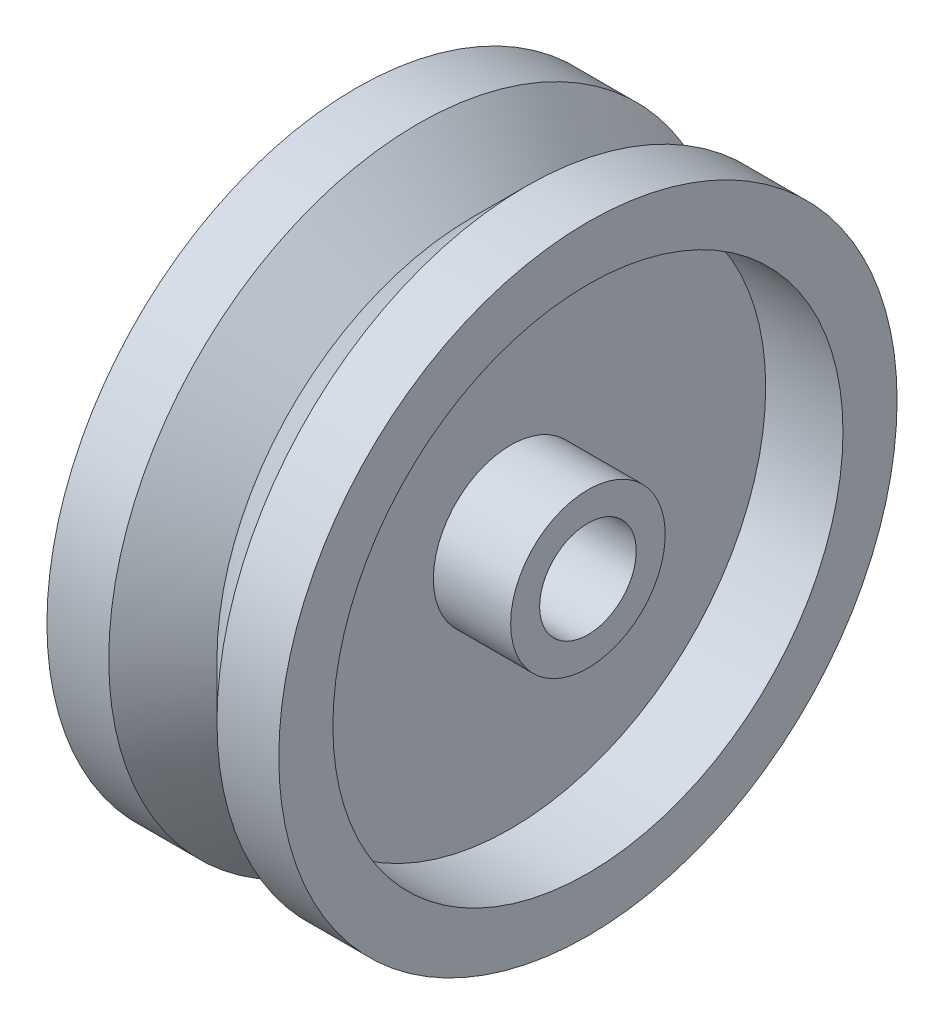
ISO-10303-21;
HEADER;
FILE_DESCRIPTION(('STEP AP214'),'2;1');
FILE_NAME('part.step','',(''),(''),'','','');
FILE_SCHEMA(('AUTOMOTIVE_DESIGN { 1 0 10303 214 1 1 1 1 }'));
ENDSEC;
DATA;
#1=APPLICATION_CONTEXT('core data for automotive mechanical design processes');
#2=APPLICATION_PROTOCOL_DEFINITION('international standard','automotive_design',2000,#1);
#3=PRODUCT_CONTEXT('',#1,'mechanical');
#4=PRODUCT('Part','Part','',(#3));
#5=PRODUCT_RELATED_PRODUCT_CATEGORY('part','',(#4));
#6=PRODUCT_DEFINITION_FORMATION('','',#4);
#7=PRODUCT_DEFINITION_CONTEXT('part definition',#1,'design');
#8=PRODUCT_DEFINITION('design','',#6,#7);
#9=PRODUCT_DEFINITION_SHAPE('','',#8);
#10=(LENGTH_UNIT() NAMED_UNIT(*) SI_UNIT(.MILLI.,.METRE.));
#11=(NAMED_UNIT(*) PLANE_ANGLE_UNIT() SI_UNIT($,.RADIAN.));
#12=(NAMED_UNIT(*) SI_UNIT($,.STERADIAN.) SOLID_ANGLE_UNIT());
#13=UNCERTAINTY_MEASURE_WITH_UNIT(LENGTH_MEASURE(1.E-05),#10,'distance_accuracy_value','');
#14=(GEOMETRIC_REPRESENTATION_CONTEXT(3) GLOBAL_UNCERTAINTY_ASSIGNED_CONTEXT((#13)) GLOBAL_UNIT_ASSIGNED_CONTEXT((#10,
#11,#12)) REPRESENTATION_CONTEXT('',''));
#15=CARTESIAN_POINT('',(0.,0.,0.));
#16=DIRECTION('',(0.,0.,1.));
#17=DIRECTION('',(1.,0.,0.));
#18=AXIS2_PLACEMENT_3D('',#15,#16,#17);
#19=CARTESIAN_POINT('',(-7.5,0.,-3.125));
#20=DIRECTION('',(1.,0.,0.));
#21=DIRECTION('',(0.,0.,-1.));
#22=AXIS2_PLACEMENT_3D('',#19,#20,#21);
#23=PLANE('',#22);
#24=CARTESIAN_POINT('',(-7.49999999999999,0.,0.));
#25=DIRECTION('',(-1.,0.,0.));
#26=DIRECTION('',(0.,0.,1.));
#27=AXIS2_PLACEMENT_3D('',#24,#25,#26);
#28=CIRCLE('',#27,3.125);
#29=CARTESIAN_POINT('',(-7.49999999999999,0.,3.125));
#30=VERTEX_POINT('',#29);
#31=EDGE_CURVE('E88',#30,#30,#28,.T.);
#32=ORIENTED_EDGE('',*,*,#31,.F.);
#33=EDGE_LOOP('',(#32));
#34=FACE_BOUND('',#33,.T.);
#35=CARTESIAN_POINT('',(-7.49999999999999,0.,0.));
#36=DIRECTION('',(-1.,0.,0.));
#37=DIRECTION('',(0.,0.,1.));
#38=AXIS2_PLACEMENT_3D('',#35,#36,#37);
#39=CIRCLE('',#38,5.);
#40=CARTESIAN_POINT('',(-7.49999999999999,0.,5.));
#41=VERTEX_POINT('',#40);
#42=EDGE_CURVE('E10',#41,#41,#39,.T.);
#43=ORIENTED_EDGE('',*,*,#42,.T.);
#44=EDGE_LOOP('',(#43));
#45=FACE_BOUND('',#44,.T.);
#46=ADVANCED_FACE('F39',(#34,#45),#23,.F.);
#47=CARTESIAN_POINT('',(-45.0431034482759,0.,0.));
#48=DIRECTION('',(-1.,0.,0.));
#49=DIRECTION('',(0.,0.,1.));
#50=AXIS2_PLACEMENT_3D('',#47,#48,#49);
#51=CYLINDRICAL_SURFACE('',#50,5.);
#52=ORIENTED_EDGE('',*,*,#42,.F.);
#53=EDGE_LOOP('',(#52));
#54=FACE_BOUND('',#53,.T.);
#55=CARTESIAN_POINT('',(-2.5,0.,0.));
#56=DIRECTION('',(-1.,0.,0.));
#57=DIRECTION('',(0.,0.,1.));
#58=AXIS2_PLACEMENT_3D('',#55,#56,#57);
#59=CIRCLE('',#58,5.);
#60=CARTESIAN_POINT('',(-2.5,0.,5.));
#61=VERTEX_POINT('',#60);
#62=EDGE_CURVE('E45',#61,#61,#59,.T.);
#63=ORIENTED_EDGE('',*,*,#62,.T.);
#64=EDGE_LOOP('',(#63));
#65=FACE_BOUND('',#64,.T.);
#66=ADVANCED_FACE('F95',(#54,#65),#51,.T.);
#67=CARTESIAN_POINT('',(-2.5,0.,-16.5));
#68=DIRECTION('',(1.,0.,0.));
#69=DIRECTION('',(0.,0.,-1.));
#70=AXIS2_PLACEMENT_3D('',#67,#68,#69);
#71=PLANE('',#70);
#72=ORIENTED_EDGE('',*,*,#62,.F.);
#73=EDGE_LOOP('',(#72));
#74=FACE_BOUND('',#73,.T.);
#75=CARTESIAN_POINT('',(-2.5,0.,0.));
#76=DIRECTION('',(-1.,0.,0.));
#77=DIRECTION('',(0.,0.,1.));
#78=AXIS2_PLACEMENT_3D('',#75,#76,#77);
#79=CIRCLE('',#78,16.5);
#80=CARTESIAN_POINT('',(-2.5,0.,16.5));
#81=VERTEX_POINT('',#80);
#82=EDGE_CURVE('E49',#81,#81,#79,.T.);
#83=ORIENTED_EDGE('',*,*,#82,.T.);
#84=EDGE_LOOP('',(#83));
#85=FACE_BOUND('',#84,.T.);
#86=ADVANCED_FACE('F99',(#74,#85),#71,.F.);
#87=CARTESIAN_POINT('',(-45.0431034482759,0.,0.));
#88=DIRECTION('',(-1.,0.,0.));
#89=DIRECTION('',(0.,0.,1.));
#90=AXIS2_PLACEMENT_3D('',#87,#88,#89);
#91=CYLINDRICAL_SURFACE('',#90,16.5);
#92=ORIENTED_EDGE('',*,*,#82,.F.);
#93=EDGE_LOOP('',(#92));
#94=FACE_BOUND('',#93,.T.);
#95=CARTESIAN_POINT('',(-7.5,0.,0.));
#96=DIRECTION('',(-1.,0.,0.));
#97=DIRECTION('',(0.,0.,1.));
#98=AXIS2_PLACEMENT_3D('',#95,#96,#97);
#99=CIRCLE('',#98,16.5);
#100=CARTESIAN_POINT('',(-7.5,0.,16.5));
#101=VERTEX_POINT('',#100);
#102=EDGE_CURVE('E53',#101,#101,#99,.T.);
#103=ORIENTED_EDGE('',*,*,#102,.T.);
#104=EDGE_LOOP('',(#103));
#105=FACE_BOUND('',#104,.T.);
#106=ADVANCED_FACE('F104',(#94,#105),#91,.F.);
#107=CARTESIAN_POINT('',(-7.5,0.,-16.5));
#108=DIRECTION('',(1.,0.,0.));
#109=DIRECTION('',(0.,0.,-1.));
#110=AXIS2_PLACEMENT_3D('',#107,#108,#109);
#111=PLANE('',#110);
#112=ORIENTED_EDGE('',*,*,#102,.F.);
#113=EDGE_LOOP('',(#112));
#114=FACE_BOUND('',#113,.T.);
#115=CARTESIAN_POINT('',(-7.50000000000001,0.,0.));
#116=DIRECTION('',(-1.,0.,0.));
#117=DIRECTION('',(0.,0.,1.));
#118=AXIS2_PLACEMENT_3D('',#115,#116,#117);
#119=CIRCLE('',#118,20.);
#120=CARTESIAN_POINT('',(-7.50000000000001,0.,20.));
#121=VERTEX_POINT('',#120);
#122=EDGE_CURVE('E58',#121,#121,#119,.T.);
#123=ORIENTED_EDGE('',*,*,#122,.T.);
#124=EDGE_LOOP('',(#123));
#125=FACE_BOUND('',#124,.T.);
#126=ADVANCED_FACE('F110',(#114,#125),#111,.F.);
#127=CARTESIAN_POINT('',(-45.0431034482759,0.,0.));
#128=DIRECTION('',(-1.,0.,0.));
#129=DIRECTION('',(0.,0.,1.));
#130=AXIS2_PLACEMENT_3D('',#127,#128,#129);
#131=CYLINDRICAL_SURFACE('',#130,20.);
#132=ORIENTED_EDGE('',*,*,#122,.F.);
#133=EDGE_LOOP('',(#132));
#134=FACE_BOUND('',#133,.T.);
#135=CARTESIAN_POINT('',(-3.50000000000003,0.,0.));
#136=DIRECTION('',(-1.,0.,0.));
#137=DIRECTION('',(0.,0.,1.));
#138=AXIS2_PLACEMENT_3D('',#135,#136,#137);
#139=CIRCLE('',#138,20.);
#140=CARTESIAN_POINT('',(-3.50000000000003,0.,20.));
#141=VERTEX_POINT('',#140);
#142=EDGE_CURVE('E61',#141,#141,#139,.T.);
#143=ORIENTED_EDGE('',*,*,#142,.T.);
#144=EDGE_LOOP('',(#143));
#145=FACE_BOUND('',#144,.T.);
#146=ADVANCED_FACE('F114',(#134,#145),#131,.T.);
#147=CARTESIAN_POINT('',(0.,0.,0.));
#148=DIRECTION('',(-1.,0.,0.));
#149=DIRECTION('',(0.,0.,1.));
#150=AXIS2_PLACEMENT_3D('',#147,#148,#149);
#151=CONICAL_SURFACE('',#150,16.5,0.785398163397444);
#152=ORIENTED_EDGE('',*,*,#142,.F.);
#153=EDGE_LOOP('',(#152));
#154=FACE_BOUND('',#153,.T.);
#155=CARTESIAN_POINT('',(0.,0.,0.));
#156=DIRECTION('',(-1.,0.,0.));
#157=DIRECTION('',(0.,0.,1.));
#158=AXIS2_PLACEMENT_3D('',#155,#156,#157);
#159=CIRCLE('',#158,16.5);
#160=CARTESIAN_POINT('',(0.,0.,16.5));
#161=VERTEX_POINT('',#160);
#162=EDGE_CURVE('E64',#161,#161,#159,.T.);
#163=ORIENTED_EDGE('',*,*,#162,.T.);
#164=EDGE_LOOP('',(#163));
#165=FACE_BOUND('',#164,.T.);
#166=ADVANCED_FACE('F118',(#154,#165),#151,.T.);
#167=CARTESIAN_POINT('',(3.49999999999996,0.,0.));
#168=DIRECTION('',(1.,0.,0.));
#169=DIRECTION('',(0.,0.,-1.));
#170=AXIS2_PLACEMENT_3D('',#167,#168,#169);
#171=CONICAL_SURFACE('',#170,20.,0.785398163397453);
#172=ORIENTED_EDGE('',*,*,#162,.F.);
#173=EDGE_LOOP('',(#172));
#174=FACE_BOUND('',#173,.T.);
#175=CARTESIAN_POINT('',(3.49999999999996,0.,0.));
#176=DIRECTION('',(-1.,0.,0.));
#177=DIRECTION('',(0.,0.,1.));
#178=AXIS2_PLACEMENT_3D('',#175,#176,#177);
#179=CIRCLE('',#178,20.);
#180=CARTESIAN_POINT('',(3.49999999999996,0.,20.));
#181=VERTEX_POINT('',#180);
#182=EDGE_CURVE('E67',#181,#181,#179,.T.);
#183=ORIENTED_EDGE('',*,*,#182,.T.);
#184=EDGE_LOOP('',(#183));
#185=FACE_BOUND('',#184,.T.);
#186=ADVANCED_FACE('F122',(#174,#185),#171,.T.);
#187=CARTESIAN_POINT('',(-45.0431034482759,0.,0.));
#188=DIRECTION('',(-1.,0.,0.));
#189=DIRECTION('',(0.,0.,1.));
#190=AXIS2_PLACEMENT_3D('',#187,#188,#189);
#191=CYLINDRICAL_SURFACE('',#190,20.);
#192=ORIENTED_EDGE('',*,*,#182,.F.);
#193=EDGE_LOOP('',(#192));
#194=FACE_BOUND('',#193,.T.);
#195=CARTESIAN_POINT('',(7.50000000000001,0.,0.));
#196=DIRECTION('',(-1.,0.,0.));
#197=DIRECTION('',(0.,0.,1.));
#198=AXIS2_PLACEMENT_3D('',#195,#196,#197);
#199=CIRCLE('',#198,20.);
#200=CARTESIAN_POINT('',(7.50000000000001,0.,20.));
#201=VERTEX_POINT('',#200);
#202=EDGE_CURVE('E70',#201,#201,#199,.T.);
#203=ORIENTED_EDGE('',*,*,#202,.T.);
#204=EDGE_LOOP('',(#203));
#205=FACE_BOUND('',#204,.T.);
#206=ADVANCED_FACE('F126',(#194,#205),#191,.T.);
#207=CARTESIAN_POINT('',(7.50000000000001,0.,-16.5));
#208=DIRECTION('',(-1.,0.,0.));
#209=DIRECTION('',(0.,0.,1.));
#210=AXIS2_PLACEMENT_3D('',#207,#208,#209);
#211=PLANE('',#210);
#212=ORIENTED_EDGE('',*,*,#202,.F.);
#213=EDGE_LOOP('',(#212));
#214=FACE_BOUND('',#213,.T.);
#215=CARTESIAN_POINT('',(7.50000000000001,0.,0.));
#216=DIRECTION('',(-1.,0.,0.));
#217=DIRECTION('',(0.,0.,1.));
#218=AXIS2_PLACEMENT_3D('',#215,#216,#217);
#219=CIRCLE('',#218,16.5);
#220=CARTESIAN_POINT('',(7.50000000000001,0.,16.5));
#221=VERTEX_POINT('',#220);
#222=EDGE_CURVE('E73',#221,#221,#219,.T.);
#223=ORIENTED_EDGE('',*,*,#222,.T.);
#224=EDGE_LOOP('',(#223));
#225=FACE_BOUND('',#224,.T.);
#226=ADVANCED_FACE('F130',(#214,#225),#211,.F.);
#227=CARTESIAN_POINT('',(-45.0431034482759,0.,0.));
#228=DIRECTION('',(-1.,0.,0.));
#229=DIRECTION('',(0.,0.,1.));
#230=AXIS2_PLACEMENT_3D('',#227,#228,#229);
#231=CYLINDRICAL_SURFACE('',#230,16.5);
#232=ORIENTED_EDGE('',*,*,#222,.F.);
#233=EDGE_LOOP('',(#232));
#234=FACE_BOUND('',#233,.T.);
#235=CARTESIAN_POINT('',(2.5,0.,0.));
#236=DIRECTION('',(-1.,0.,0.));
#237=DIRECTION('',(0.,0.,1.));
#238=AXIS2_PLACEMENT_3D('',#235,#236,#237);
#239=CIRCLE('',#238,16.5);
#240=CARTESIAN_POINT('',(2.5,0.,16.5));
#241=VERTEX_POINT('',#240);
#242=EDGE_CURVE('E76',#241,#241,#239,.T.);
#243=ORIENTED_EDGE('',*,*,#242,.T.);
#244=EDGE_LOOP('',(#243));
#245=FACE_BOUND('',#244,.T.);
#246=ADVANCED_FACE('F134',(#234,#245),#231,.F.);
#247=CARTESIAN_POINT('',(2.5,0.,-16.5));
#248=DIRECTION('',(-1.,0.,0.));
#249=DIRECTION('',(0.,0.,1.));
#250=AXIS2_PLACEMENT_3D('',#247,#248,#249);
#251=PLANE('',#250);
#252=ORIENTED_EDGE('',*,*,#242,.F.);
#253=EDGE_LOOP('',(#252));
#254=FACE_BOUND('',#253,.T.);
#255=CARTESIAN_POINT('',(2.5,0.,0.));
#256=DIRECTION('',(-1.,0.,0.));
#257=DIRECTION('',(0.,0.,1.));
#258=AXIS2_PLACEMENT_3D('',#255,#256,#257);
#259=CIRCLE('',#258,5.);
#260=CARTESIAN_POINT('',(2.5,0.,5.));
#261=VERTEX_POINT('',#260);
#262=EDGE_CURVE('E79',#261,#261,#259,.T.);
#263=ORIENTED_EDGE('',*,*,#262,.T.);
#264=EDGE_LOOP('',(#263));
#265=FACE_BOUND('',#264,.T.);
#266=ADVANCED_FACE('F138',(#254,#265),#251,.F.);
#267=CARTESIAN_POINT('',(-45.0431034482759,0.,0.));
#268=DIRECTION('',(-1.,0.,0.));
#269=DIRECTION('',(0.,0.,1.));
#270=AXIS2_PLACEMENT_3D('',#267,#268,#269);
#271=CYLINDRICAL_SURFACE('',#270,5.);
#272=ORIENTED_EDGE('',*,*,#262,.F.);
#273=EDGE_LOOP('',(#272));
#274=FACE_BOUND('',#273,.T.);
#275=CARTESIAN_POINT('',(7.50000000000001,0.,0.));
#276=DIRECTION('',(-1.,0.,0.));
#277=DIRECTION('',(0.,0.,1.));
#278=AXIS2_PLACEMENT_3D('',#275,#276,#277);
#279=CIRCLE('',#278,5.);
#280=CARTESIAN_POINT('',(7.50000000000001,0.,5.));
#281=VERTEX_POINT('',#280);
#282=EDGE_CURVE('E82',#281,#281,#279,.T.);
#283=ORIENTED_EDGE('',*,*,#282,.T.);
#284=EDGE_LOOP('',(#283));
#285=FACE_BOUND('',#284,.T.);
#286=ADVANCED_FACE('F142',(#274,#285),#271,.T.);
#287=CARTESIAN_POINT('',(7.50000000000001,0.,-3.125));
#288=DIRECTION('',(-1.,0.,0.));
#289=DIRECTION('',(0.,0.,1.));
#290=AXIS2_PLACEMENT_3D('',#287,#288,#289);
#291=PLANE('',#290);
#292=ORIENTED_EDGE('',*,*,#282,.F.);
#293=EDGE_LOOP('',(#292));
#294=FACE_BOUND('',#293,.T.);
#295=CARTESIAN_POINT('',(7.50000000000001,0.,0.));
#296=DIRECTION('',(-1.,0.,0.));
#297=DIRECTION('',(0.,0.,1.));
#298=AXIS2_PLACEMENT_3D('',#295,#296,#297);
#299=CIRCLE('',#298,3.125);
#300=CARTESIAN_POINT('',(7.50000000000001,0.,3.125));
#301=VERTEX_POINT('',#300);
#302=EDGE_CURVE('E85',#301,#301,#299,.T.);
#303=ORIENTED_EDGE('',*,*,#302,.T.);
#304=EDGE_LOOP('',(#303));
#305=FACE_BOUND('',#304,.T.);
#306=ADVANCED_FACE('F146',(#294,#305),#291,.F.);
#307=CARTESIAN_POINT('',(-45.0431034482759,0.,0.));
#308=DIRECTION('',(-1.,0.,0.));
#309=DIRECTION('',(0.,0.,1.));
#310=AXIS2_PLACEMENT_3D('',#307,#308,#309);
#311=CYLINDRICAL_SURFACE('',#310,3.125);
#312=ORIENTED_EDGE('',*,*,#302,.F.);
#313=EDGE_LOOP('',(#312));
#314=FACE_BOUND('',#313,.T.);
#315=ORIENTED_EDGE('',*,*,#31,.T.);
#316=EDGE_LOOP('',(#315));
#317=FACE_BOUND('',#316,.T.);
#318=ADVANCED_FACE('F92',(#314,#317),#311,.F.);
#319=CLOSED_SHELL('',(#46,#66,#86,#106,#126,#146,#166,#186,#206,#226,#246,#266,#286,#306,#318));
#320=MANIFOLD_SOLID_BREP('B2',#319);
#321=ADVANCED_BREP_SHAPE_REPRESENTATION('',(#18,#320),#14);
#322=SHAPE_DEFINITION_REPRESENTATION(#9,#321);
ENDSEC;
END-ISO-10303-21;
